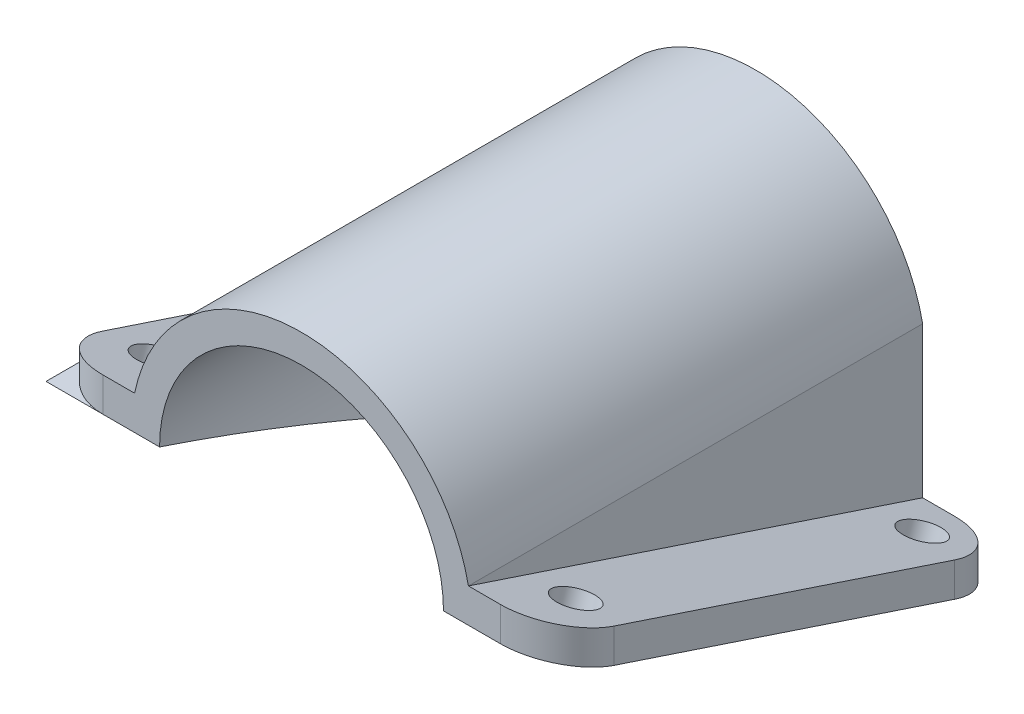
ISO-10303-21;
HEADER;
FILE_DESCRIPTION(('STEP AP214'),'2;1');
FILE_NAME('part.step','',(''),(''),'','','');
FILE_SCHEMA(('AUTOMOTIVE_DESIGN { 1 0 10303 214 1 1 1 1 }'));
ENDSEC;
DATA;
#1=APPLICATION_CONTEXT('core data for automotive mechanical design processes');
#2=APPLICATION_PROTOCOL_DEFINITION('international standard','automotive_design',2000,#1);
#3=PRODUCT_CONTEXT('',#1,'mechanical');
#4=PRODUCT('Part','Part','',(#3));
#5=PRODUCT_RELATED_PRODUCT_CATEGORY('part','',(#4));
#6=PRODUCT_DEFINITION_FORMATION('','',#4);
#7=PRODUCT_DEFINITION_CONTEXT('part definition',#1,'design');
#8=PRODUCT_DEFINITION('design','',#6,#7);
#9=PRODUCT_DEFINITION_SHAPE('','',#8);
#10=(LENGTH_UNIT() NAMED_UNIT(*) SI_UNIT(.MILLI.,.METRE.));
#11=(NAMED_UNIT(*) PLANE_ANGLE_UNIT() SI_UNIT($,.RADIAN.));
#12=(NAMED_UNIT(*) SI_UNIT($,.STERADIAN.) SOLID_ANGLE_UNIT());
#13=UNCERTAINTY_MEASURE_WITH_UNIT(LENGTH_MEASURE(1.E-05),#10,'distance_accuracy_value','');
#14=(GEOMETRIC_REPRESENTATION_CONTEXT(3) GLOBAL_UNCERTAINTY_ASSIGNED_CONTEXT((#13)) GLOBAL_UNIT_ASSIGNED_CONTEXT((#10,
#11,#12)) REPRESENTATION_CONTEXT('',''));
#15=CARTESIAN_POINT('',(0.,0.,0.));
#16=DIRECTION('',(0.,0.,1.));
#17=DIRECTION('',(1.,0.,0.));
#18=AXIS2_PLACEMENT_3D('',#15,#16,#17);
#19=CARTESIAN_POINT('',(22.5,0.,40.));
#20=DIRECTION('',(-1.,0.,0.));
#21=DIRECTION('',(0.,0.,1.));
#22=AXIS2_PLACEMENT_3D('',#19,#20,#21);
#23=PLANE('',#22);
#24=DIRECTION('',(0.,-0.315005947483541,-0.949089697051863));
#25=VECTOR('',#24,1.);
#26=CARTESIAN_POINT('',(22.5,3.,40.));
#27=LINE('',#26,#25);
#28=CARTESIAN_POINT('',(22.5,1.34048378956153,35.));
#29=VERTEX_POINT('',#28);
#30=CARTESIAN_POINT('',(22.5,-8.6166134730693,4.99999999999999));
#31=VERTEX_POINT('',#30);
#32=EDGE_CURVE('E206',#29,#31,#27,.T.);
#33=ORIENTED_EDGE('',*,*,#32,.F.);
#34=DIRECTION('',(0.,1.,0.));
#35=VECTOR('',#34,1.);
#36=CARTESIAN_POINT('',(22.5,0.,35.));
#37=LINE('',#36,#35);
#38=CARTESIAN_POINT('',(22.5,-1.65951621043847,35.));
#39=VERTEX_POINT('',#38);
#40=EDGE_CURVE('E293',#29,#39,#37,.F.);
#41=ORIENTED_EDGE('',*,*,#40,.T.);
#42=DIRECTION('',(0.,-0.315005947483541,-0.949089697051863));
#43=VECTOR('',#42,1.);
#44=CARTESIAN_POINT('',(22.5,0.,40.));
#45=LINE('',#44,#43);
#46=CARTESIAN_POINT('',(22.5,-11.6166134730693,4.99999999999999));
#47=VERTEX_POINT('',#46);
#48=EDGE_CURVE('E235',#39,#47,#45,.T.);
#49=ORIENTED_EDGE('',*,*,#48,.T.);
#50=DIRECTION('',(0.,1.,0.));
#51=VECTOR('',#50,1.);
#52=CARTESIAN_POINT('',(22.5,0.,5.));
#53=LINE('',#52,#51);
#54=EDGE_CURVE('E290',#47,#31,#53,.T.);
#55=ORIENTED_EDGE('',*,*,#54,.T.);
#56=EDGE_LOOP('',(#33,#41,#49,#55));
#57=FACE_BOUND('',#56,.T.);
#58=ADVANCED_FACE('F73',(#57),#23,.F.);
#59=CARTESIAN_POINT('',(0.,0.,40.));
#60=DIRECTION('',(0.,0.,-1.));
#61=DIRECTION('',(-1.,0.,0.));
#62=AXIS2_PLACEMENT_3D('',#59,#60,#61);
#63=CYLINDRICAL_SURFACE('',#62,15.);
#64=CARTESIAN_POINT('',(0.,0.,0.));
#65=DIRECTION('',(0.,0.,1.));
#66=DIRECTION('',(1.,0.,0.));
#67=AXIS2_PLACEMENT_3D('',#64,#65,#66);
#68=CIRCLE('',#67,15.);
#69=CARTESIAN_POINT('',(14.6969384566991,3.,0.));
#70=VERTEX_POINT('',#69);
#71=CARTESIAN_POINT('',(-14.6969384566991,3.,0.));
#72=VERTEX_POINT('',#71);
#73=EDGE_CURVE('E251',#70,#72,#68,.T.);
#74=ORIENTED_EDGE('',*,*,#73,.T.);
#75=DIRECTION('',(0.,0.,-1.));
#76=VECTOR('',#75,1.);
#77=CARTESIAN_POINT('',(-14.6969384566991,3.,40.));
#78=LINE('',#77,#76);
#79=CARTESIAN_POINT('',(-14.6969384566991,3.,40.));
#80=VERTEX_POINT('',#79);
#81=EDGE_CURVE('E183',#80,#72,#78,.T.);
#82=ORIENTED_EDGE('',*,*,#81,.F.);
#83=CARTESIAN_POINT('',(0.,0.,40.));
#84=DIRECTION('',(0.,0.,1.));
#85=DIRECTION('',(1.,0.,0.));
#86=AXIS2_PLACEMENT_3D('',#83,#84,#85);
#87=CIRCLE('',#86,15.);
#88=CARTESIAN_POINT('',(14.6969384566991,3.,40.));
#89=VERTEX_POINT('',#88);
#90=EDGE_CURVE('E254',#89,#80,#87,.T.);
#91=ORIENTED_EDGE('',*,*,#90,.F.);
#92=DIRECTION('',(0.,0.,-1.));
#93=VECTOR('',#92,1.);
#94=CARTESIAN_POINT('',(14.6969384566991,3.,40.));
#95=LINE('',#94,#93);
#96=EDGE_CURVE('E263',#89,#70,#95,.T.);
#97=ORIENTED_EDGE('',*,*,#96,.T.);
#98=EDGE_LOOP('',(#74,#82,#91,#97));
#99=FACE_BOUND('',#98,.T.);
#100=ADVANCED_FACE('F320',(#99),#63,.T.);
#101=CARTESIAN_POINT('',(0.,0.,40.));
#102=DIRECTION('',(0.,0.,-1.));
#103=DIRECTION('',(-1.,0.,0.));
#104=AXIS2_PLACEMENT_3D('',#101,#102,#103);
#105=CYLINDRICAL_SURFACE('',#104,12.5);
#106=CARTESIAN_POINT('',(0.,0.,0.5));
#107=DIRECTION('',(0.,0.,1.));
#108=DIRECTION('',(1.,0.,0.));
#109=AXIS2_PLACEMENT_3D('',#106,#107,#108);
#110=CIRCLE('',#109,12.5);
#111=CARTESIAN_POINT('',(12.5,0.,0.5));
#112=VERTEX_POINT('',#111);
#113=EDGE_CURVE('E12',#112,#112,#110,.F.);
#114=ORIENTED_EDGE('',*,*,#113,.T.);
#115=EDGE_LOOP('',(#114));
#116=FACE_BOUND('',#115,.T.);
#117=CARTESIAN_POINT('',(0.,0.,40.));
#118=DIRECTION('',(0.,-0.949089697051863,0.315005947483541));
#119=DIRECTION('',(0.,-0.315005947483541,-0.949089697051863));
#120=AXIS2_PLACEMENT_3D('',#117,#118,#119);
#121=ELLIPSE('',#120,39.6817904546171,12.5);
#122=CARTESIAN_POINT('',(12.5,0.,40.));
#123=VERTEX_POINT('',#122);
#124=CARTESIAN_POINT('',(-12.5,0.,40.));
#125=VERTEX_POINT('',#124);
#126=EDGE_CURVE('E241',#123,#125,#121,.F.);
#127=ORIENTED_EDGE('',*,*,#126,.F.);
#128=CARTESIAN_POINT('',(0.,0.,40.));
#129=DIRECTION('',(0.,0.,1.));
#130=DIRECTION('',(1.,0.,0.));
#131=AXIS2_PLACEMENT_3D('',#128,#129,#130);
#132=CIRCLE('',#131,12.5);
#133=EDGE_CURVE('E257',#123,#125,#132,.T.);
#134=ORIENTED_EDGE('',*,*,#133,.T.);
#135=EDGE_LOOP('',(#127,#134));
#136=FACE_BOUND('',#135,.T.);
#137=ADVANCED_FACE('F328',(#116,#136),#105,.F.);
#138=CARTESIAN_POINT('',(0.,0.,0.));
#139=DIRECTION('',(0.,0.,1.));
#140=DIRECTION('',(1.,0.,0.));
#141=AXIS2_PLACEMENT_3D('',#138,#139,#140);
#142=PLANE('',#141);
#143=CARTESIAN_POINT('',(0.,0.,0.));
#144=DIRECTION('',(0.,0.,1.));
#145=DIRECTION('',(1.,0.,0.));
#146=AXIS2_PLACEMENT_3D('',#143,#144,#145);
#147=CIRCLE('',#146,13.);
#148=CARTESIAN_POINT('',(13.,0.,0.));
#149=VERTEX_POINT('',#148);
#150=EDGE_CURVE('E82',#149,#149,#147,.T.);
#151=ORIENTED_EDGE('',*,*,#150,.T.);
#152=EDGE_LOOP('',(#151));
#153=FACE_BOUND('',#152,.T.);
#154=DIRECTION('',(1.,0.,0.));
#155=VECTOR('',#154,1.);
#156=CARTESIAN_POINT('',(-22.501,-13.2761296835078,0.));
#157=LINE('',#156,#155);
#158=CARTESIAN_POINT('',(-17.501,-13.2761296835078,0.));
#159=VERTEX_POINT('',#158);
#160=CARTESIAN_POINT('',(17.5,-13.2761296835078,0.));
#161=VERTEX_POINT('',#160);
#162=EDGE_CURVE('E233',#159,#161,#157,.T.);
#163=ORIENTED_EDGE('',*,*,#162,.F.);
#164=DIRECTION('',(0.,1.,0.));
#165=VECTOR('',#164,1.);
#166=CARTESIAN_POINT('',(-17.501,-10.2761296835078,0.));
#167=LINE('',#166,#165);
#168=CARTESIAN_POINT('',(-17.501,-10.2761296835078,0.));
#169=VERTEX_POINT('',#168);
#170=EDGE_CURVE('E191',#159,#169,#167,.T.);
#171=ORIENTED_EDGE('',*,*,#170,.T.);
#172=DIRECTION('',(-1.,0.,0.));
#173=VECTOR('',#172,1.);
#174=CARTESIAN_POINT('',(-14.6969384566991,-10.2761296835078,0.));
#175=LINE('',#174,#173);
#176=CARTESIAN_POINT('',(-14.6969384566991,-10.2761296835078,0.));
#177=VERTEX_POINT('',#176);
#178=EDGE_CURVE('E174',#177,#169,#175,.T.);
#179=ORIENTED_EDGE('',*,*,#178,.F.);
#180=DIRECTION('',(0.,-1.,0.));
#181=VECTOR('',#180,1.);
#182=CARTESIAN_POINT('',(-14.6969384566991,-10.2761296835078,0.));
#183=LINE('',#182,#181);
#184=EDGE_CURVE('E179',#72,#177,#183,.T.);
#185=ORIENTED_EDGE('',*,*,#184,.F.);
#186=ORIENTED_EDGE('',*,*,#73,.F.);
#187=DIRECTION('',(0.,1.,0.));
#188=VECTOR('',#187,1.);
#189=CARTESIAN_POINT('',(14.6969384566991,-10.2761296835078,0.));
#190=LINE('',#189,#188);
#191=CARTESIAN_POINT('',(14.6969384566991,-10.2761296835078,0.));
#192=VERTEX_POINT('',#191);
#193=EDGE_CURVE('E207',#192,#70,#190,.T.);
#194=ORIENTED_EDGE('',*,*,#193,.F.);
#195=DIRECTION('',(1.,0.,0.));
#196=VECTOR('',#195,1.);
#197=CARTESIAN_POINT('',(14.6969384566991,-10.2761296835078,0.));
#198=LINE('',#197,#196);
#199=CARTESIAN_POINT('',(17.5,-10.2761296835078,0.));
#200=VERTEX_POINT('',#199);
#201=EDGE_CURVE('E212',#192,#200,#198,.T.);
#202=ORIENTED_EDGE('',*,*,#201,.T.);
#203=DIRECTION('',(0.,1.,0.));
#204=VECTOR('',#203,1.);
#205=CARTESIAN_POINT('',(17.5,0.,0.));
#206=LINE('',#205,#204);
#207=EDGE_CURVE('E89',#200,#161,#206,.F.);
#208=ORIENTED_EDGE('',*,*,#207,.T.);
#209=EDGE_LOOP('',(#163,#171,#179,#185,#186,#194,#202,#208));
#210=FACE_BOUND('',#209,.T.);
#211=ADVANCED_FACE('F189',(#153,#210),#142,.F.);
#212=CARTESIAN_POINT('',(0.,0.,40.));
#213=DIRECTION('',(0.,0.,1.));
#214=DIRECTION('',(1.,0.,0.));
#215=AXIS2_PLACEMENT_3D('',#212,#213,#214);
#216=PLANE('',#215);
#217=DIRECTION('',(-1.,0.,0.));
#218=VECTOR('',#217,1.);
#219=CARTESIAN_POINT('',(-12.5,3.,40.));
#220=LINE('',#219,#218);
#221=CARTESIAN_POINT('',(-17.5,3.,40.));
#222=VERTEX_POINT('',#221);
#223=EDGE_CURVE('E176',#80,#222,#220,.T.);
#224=ORIENTED_EDGE('',*,*,#223,.T.);
#225=DIRECTION('',(0.,1.,0.));
#226=VECTOR('',#225,1.);
#227=CARTESIAN_POINT('',(-17.5,0.,40.));
#228=LINE('',#227,#226);
#229=CARTESIAN_POINT('',(-17.5,0.,40.));
#230=VERTEX_POINT('',#229);
#231=EDGE_CURVE('E283',#222,#230,#228,.F.);
#232=ORIENTED_EDGE('',*,*,#231,.T.);
#233=DIRECTION('',(-1.,0.,0.));
#234=VECTOR('',#233,1.);
#235=CARTESIAN_POINT('',(-12.5,0.,40.));
#236=LINE('',#235,#234);
#237=EDGE_CURVE('E268',#125,#230,#236,.T.);
#238=ORIENTED_EDGE('',*,*,#237,.F.);
#239=ORIENTED_EDGE('',*,*,#133,.F.);
#240=DIRECTION('',(1.,0.,0.));
#241=VECTOR('',#240,1.);
#242=CARTESIAN_POINT('',(0.,0.,40.));
#243=LINE('',#242,#241);
#244=CARTESIAN_POINT('',(17.5,0.,40.));
#245=VERTEX_POINT('',#244);
#246=EDGE_CURVE('E247',#123,#245,#243,.T.);
#247=ORIENTED_EDGE('',*,*,#246,.T.);
#248=DIRECTION('',(0.,1.,0.));
#249=VECTOR('',#248,1.);
#250=CARTESIAN_POINT('',(17.5,3.,40.));
#251=LINE('',#250,#249);
#252=CARTESIAN_POINT('',(17.5,3.,40.));
#253=VERTEX_POINT('',#252);
#254=EDGE_CURVE('E280',#245,#253,#251,.T.);
#255=ORIENTED_EDGE('',*,*,#254,.T.);
#256=DIRECTION('',(1.,0.,0.));
#257=VECTOR('',#256,1.);
#258=CARTESIAN_POINT('',(0.,3.,40.));
#259=LINE('',#258,#257);
#260=EDGE_CURVE('E250',#89,#253,#259,.T.);
#261=ORIENTED_EDGE('',*,*,#260,.F.);
#262=ORIENTED_EDGE('',*,*,#90,.T.);
#263=EDGE_LOOP('',(#224,#232,#238,#239,#247,#255,#261,#262));
#264=FACE_BOUND('',#263,.T.);
#265=ADVANCED_FACE('F338',(#264),#216,.T.);
#266=CARTESIAN_POINT('',(-22.5,0.,40.));
#267=DIRECTION('',(-1.,0.,0.));
#268=DIRECTION('',(0.,0.,1.));
#269=AXIS2_PLACEMENT_3D('',#266,#267,#268);
#270=PLANE('',#269);
#271=DIRECTION('',(0.,0.,-1.));
#272=VECTOR('',#271,1.);
#273=CARTESIAN_POINT('',(-22.5,0.,40.));
#274=LINE('',#273,#272);
#275=CARTESIAN_POINT('',(-22.5,0.,35.));
#276=VERTEX_POINT('',#275);
#277=CARTESIAN_POINT('',(-22.5,0.,30.9612211645485));
#278=VERTEX_POINT('',#277);
#279=EDGE_CURVE('E261',#276,#278,#274,.T.);
#280=ORIENTED_EDGE('',*,*,#279,.F.);
#281=DIRECTION('',(0.,1.,0.));
#282=VECTOR('',#281,1.);
#283=CARTESIAN_POINT('',(-22.5,0.,35.));
#284=LINE('',#283,#282);
#285=CARTESIAN_POINT('',(-22.5,1.34048378956153,35.));
#286=VERTEX_POINT('',#285);
#287=EDGE_CURVE('E266',#276,#286,#284,.T.);
#288=ORIENTED_EDGE('',*,*,#287,.T.);
#289=DIRECTION('',(0.,0.315005947483541,0.949089697051863));
#290=VECTOR('',#289,1.);
#291=CARTESIAN_POINT('',(-22.5,2.70231375914999,39.1030933021999));
#292=LINE('',#291,#290);
#293=EDGE_CURVE('E204',#278,#286,#292,.T.);
#294=ORIENTED_EDGE('',*,*,#293,.F.);
#295=EDGE_LOOP('',(#280,#288,#294));
#296=FACE_BOUND('',#295,.T.);
#297=ADVANCED_FACE('F334',(#296),#270,.T.);
#298=CARTESIAN_POINT('',(-22.501,0.,0.));
#299=DIRECTION('',(0.,1.,0.));
#300=DIRECTION('',(0.,0.,1.));
#301=AXIS2_PLACEMENT_3D('',#298,#299,#300);
#302=PLANE('',#301);
#303=DIRECTION('',(1.,0.,0.));
#304=VECTOR('',#303,1.);
#305=CARTESIAN_POINT('',(-22.501,0.,30.9612211645485));
#306=LINE('',#305,#304);
#307=CARTESIAN_POINT('',(-22.501,0.,30.9612211645485));
#308=VERTEX_POINT('',#307);
#309=EDGE_CURVE('E201',#308,#278,#306,.T.);
#310=ORIENTED_EDGE('',*,*,#309,.F.);
#311=DIRECTION('',(0.,0.,1.));
#312=VECTOR('',#311,1.);
#313=CARTESIAN_POINT('',(-22.501,0.,0.));
#314=LINE('',#313,#312);
#315=CARTESIAN_POINT('',(-22.501,0.,40.));
#316=VERTEX_POINT('',#315);
#317=EDGE_CURVE('E242',#308,#316,#314,.T.);
#318=ORIENTED_EDGE('',*,*,#317,.T.);
#319=DIRECTION('',(1.,0.,0.));
#320=VECTOR('',#319,1.);
#321=CARTESIAN_POINT('',(-22.501,0.,40.));
#322=LINE('',#321,#320);
#323=EDGE_CURVE('E232',#316,#230,#322,.T.);
#324=ORIENTED_EDGE('',*,*,#323,.T.);
#325=CARTESIAN_POINT('',(-17.5,0.,35.));
#326=DIRECTION('',(0.,1.,0.));
#327=DIRECTION('',(0.,0.,1.));
#328=AXIS2_PLACEMENT_3D('',#325,#326,#327);
#329=CIRCLE('',#328,5.);
#330=EDGE_CURVE('E305',#230,#276,#329,.F.);
#331=ORIENTED_EDGE('',*,*,#330,.T.);
#332=ORIENTED_EDGE('',*,*,#279,.T.);
#333=EDGE_LOOP('',(#310,#318,#324,#331,#332));
#334=FACE_BOUND('',#333,.T.);
#335=ADVANCED_FACE('F337',(#334),#302,.T.);
#336=CARTESIAN_POINT('',(-22.501,0.,40.));
#337=DIRECTION('',(0.,-0.949089697051863,0.315005947483541));
#338=DIRECTION('',(0.,-0.315005947483541,-0.949089697051863));
#339=AXIS2_PLACEMENT_3D('',#336,#337,#338);
#340=PLANE('',#339);
#341=CARTESIAN_POINT('',(-18.501,-11.7010999460901,4.74544848525931));
#342=DIRECTION('',(0.,-0.949089697051863,0.315005947483541));
#343=DIRECTION('',(0.,-0.315005947483541,-0.949089697051863));
#344=AXIS2_PLACEMENT_3D('',#341,#342,#343);
#345=CIRCLE('',#344,1.75);
#346=CARTESIAN_POINT('',(-18.501,-12.2523603541863,3.08454151541855));
#347=VERTEX_POINT('',#346);
#348=EDGE_CURVE('E224',#347,#347,#345,.T.);
#349=ORIENTED_EDGE('',*,*,#348,.F.);
#350=EDGE_LOOP('',(#349));
#351=FACE_BOUND('',#350,.T.);
#352=CARTESIAN_POINT('',(18.5,-1.5750297374177,35.2545515147407));
#353=DIRECTION('',(0.,-0.949089697051863,0.315005947483541));
#354=DIRECTION('',(0.,-0.315005947483541,-0.949089697051863));
#355=AXIS2_PLACEMENT_3D('',#352,#353,#354);
#356=CIRCLE('',#355,1.75);
#357=CARTESIAN_POINT('',(18.5,-2.1262901455139,33.5936445448999));
#358=VERTEX_POINT('',#357);
#359=EDGE_CURVE('E223',#358,#358,#356,.T.);
#360=ORIENTED_EDGE('',*,*,#359,.F.);
#361=EDGE_LOOP('',(#360));
#362=FACE_BOUND('',#361,.T.);
#363=CARTESIAN_POINT('',(18.5,-11.7010999460901,4.74544848525931));
#364=DIRECTION('',(0.,-0.949089697051863,0.315005947483541));
#365=DIRECTION('',(0.,-0.315005947483541,-0.949089697051863));
#366=AXIS2_PLACEMENT_3D('',#363,#364,#365);
#367=CIRCLE('',#366,1.75);
#368=CARTESIAN_POINT('',(18.5,-12.2523603541863,3.08454151541855));
#369=VERTEX_POINT('',#368);
#370=EDGE_CURVE('E220',#369,#369,#367,.T.);
#371=ORIENTED_EDGE('',*,*,#370,.F.);
#372=EDGE_LOOP('',(#371));
#373=FACE_BOUND('',#372,.T.);
#374=CARTESIAN_POINT('',(-18.501,-1.5750297374177,35.2545515147407));
#375=DIRECTION('',(0.,-0.949089697051863,0.315005947483541));
#376=DIRECTION('',(0.,-0.315005947483541,-0.949089697051863));
#377=AXIS2_PLACEMENT_3D('',#374,#375,#376);
#378=CIRCLE('',#377,1.75);
#379=CARTESIAN_POINT('',(-18.501,-2.1262901455139,33.5936445448999));
#380=VERTEX_POINT('',#379);
#381=EDGE_CURVE('E227',#380,#380,#378,.T.);
#382=ORIENTED_EDGE('',*,*,#381,.F.);
#383=EDGE_LOOP('',(#382));
#384=FACE_BOUND('',#383,.T.);
#385=ORIENTED_EDGE('',*,*,#48,.F.);
#386=CARTESIAN_POINT('',(17.5,-1.65951621043847,35.));
#387=DIRECTION('',(0.,-0.949089697051863,0.315005947483541));
#388=DIRECTION('',(0.,-0.315005947483541,-0.949089697051863));
#389=AXIS2_PLACEMENT_3D('',#386,#387,#388);
#390=ELLIPSE('',#389,5.26820596149278,5.);
#391=EDGE_CURVE('E299',#39,#245,#390,.T.);
#392=ORIENTED_EDGE('',*,*,#391,.T.);
#393=ORIENTED_EDGE('',*,*,#246,.F.);
#394=ORIENTED_EDGE('',*,*,#126,.T.);
#395=ORIENTED_EDGE('',*,*,#237,.T.);
#396=ORIENTED_EDGE('',*,*,#323,.F.);
#397=DIRECTION('',(0.,-0.315005947483541,-0.949089697051863));
#398=VECTOR('',#397,1.);
#399=CARTESIAN_POINT('',(-22.501,0.,40.));
#400=LINE('',#399,#398);
#401=CARTESIAN_POINT('',(-22.501,-11.6166134730693,4.99999999999999));
#402=VERTEX_POINT('',#401);
#403=EDGE_CURVE('E236',#316,#402,#400,.T.);
#404=ORIENTED_EDGE('',*,*,#403,.T.);
#405=CARTESIAN_POINT('',(-17.501,-11.6166134730693,5.));
#406=DIRECTION('',(0.,-0.949089697051863,0.315005947483541));
#407=DIRECTION('',(0.,-0.315005947483541,-0.949089697051863));
#408=AXIS2_PLACEMENT_3D('',#405,#406,#407);
#409=ELLIPSE('',#408,5.26820596149278,5.);
#410=EDGE_CURVE('E297',#402,#159,#409,.T.);
#411=ORIENTED_EDGE('',*,*,#410,.T.);
#412=ORIENTED_EDGE('',*,*,#162,.T.);
#413=CARTESIAN_POINT('',(17.5,-11.6166134730693,5.));
#414=DIRECTION('',(0.,-0.949089697051863,0.315005947483541));
#415=DIRECTION('',(0.,0.315005947483541,0.949089697051863));
#416=AXIS2_PLACEMENT_3D('',#413,#414,#415);
#417=ELLIPSE('',#416,5.26820596149278,5.);
#418=EDGE_CURVE('E295',#161,#47,#417,.T.);
#419=ORIENTED_EDGE('',*,*,#418,.T.);
#420=EDGE_LOOP('',(#385,#392,#393,#394,#395,#396,#404,#411,#412,#419));
#421=FACE_BOUND('',#420,.T.);
#422=ADVANCED_FACE('F356',(#351,#362,#373,#384,#421),#340,.T.);
#423=CARTESIAN_POINT('',(-22.501,0.,0.));
#424=DIRECTION('',(-1.,0.,0.));
#425=DIRECTION('',(0.,0.,1.));
#426=AXIS2_PLACEMENT_3D('',#423,#424,#425);
#427=PLANE('',#426);
#428=DIRECTION('',(0.,0.315005947483541,0.949089697051863));
#429=VECTOR('',#428,1.);
#430=CARTESIAN_POINT('',(-22.501,3.,40.));
#431=LINE('',#430,#429);
#432=CARTESIAN_POINT('',(-22.501,-8.61661347306931,4.99999999999998));
#433=VERTEX_POINT('',#432);
#434=EDGE_CURVE('E186',#433,#308,#431,.T.);
#435=ORIENTED_EDGE('',*,*,#434,.F.);
#436=DIRECTION('',(0.,1.,0.));
#437=VECTOR('',#436,1.);
#438=CARTESIAN_POINT('',(-22.501,-13.2761296835078,5.));
#439=LINE('',#438,#437);
#440=EDGE_CURVE('E303',#433,#402,#439,.F.);
#441=ORIENTED_EDGE('',*,*,#440,.T.);
#442=ORIENTED_EDGE('',*,*,#403,.F.);
#443=ORIENTED_EDGE('',*,*,#317,.F.);
#444=EDGE_LOOP('',(#435,#441,#442,#443));
#445=FACE_BOUND('',#444,.T.);
#446=ADVANCED_FACE('F363',(#445),#427,.T.);
#447=CARTESIAN_POINT('',(-18.501,23.8952950289998,26.8008681477402));
#448=DIRECTION('',(0.,-0.949089697051863,0.315005947483541));
#449=DIRECTION('',(0.,-0.315005947483541,-0.949089697051863));
#450=AXIS2_PLACEMENT_3D('',#447,#448,#449);
#451=CYLINDRICAL_SURFACE('',#450,1.75);
#452=CARTESIAN_POINT('',(-18.501,1.12728402173229,34.3576448169406));
#453=DIRECTION('',(0.,-0.949089697051863,0.315005947483541));
#454=DIRECTION('',(0.,-0.315005947483541,-0.949089697051863));
#455=AXIS2_PLACEMENT_3D('',#452,#453,#454);
#456=CIRCLE('',#455,1.75);
#457=CARTESIAN_POINT('',(-18.501,0.576023613636088,32.6967378470999));
#458=VERTEX_POINT('',#457);
#459=EDGE_CURVE('E195',#458,#458,#456,.F.);
#460=ORIENTED_EDGE('',*,*,#459,.T.);
#461=EDGE_LOOP('',(#460));
#462=FACE_BOUND('',#461,.T.);
#463=ORIENTED_EDGE('',*,*,#381,.T.);
#464=EDGE_LOOP('',(#463));
#465=FACE_BOUND('',#464,.T.);
#466=ADVANCED_FACE('F405',(#462,#465),#451,.F.);
#467=CARTESIAN_POINT('',(18.5,13.7692248203274,-3.70823488174116));
#468=DIRECTION('',(0.,-0.949089697051863,0.315005947483541));
#469=DIRECTION('',(0.,-0.315005947483541,-0.949089697051863));
#470=AXIS2_PLACEMENT_3D('',#467,#468,#469);
#471=CYLINDRICAL_SURFACE('',#470,1.75);
#472=CARTESIAN_POINT('',(18.5,-8.99878618694009,3.84854178745924));
#473=DIRECTION('',(0.,-0.949089697051863,0.315005947483541));
#474=DIRECTION('',(0.,-0.315005947483541,-0.949089697051863));
#475=AXIS2_PLACEMENT_3D('',#472,#473,#474);
#476=CIRCLE('',#475,1.75);
#477=CARTESIAN_POINT('',(18.5,-9.55004659503628,2.18763481761848));
#478=VERTEX_POINT('',#477);
#479=EDGE_CURVE('E217',#478,#478,#476,.F.);
#480=ORIENTED_EDGE('',*,*,#479,.T.);
#481=EDGE_LOOP('',(#480));
#482=FACE_BOUND('',#481,.T.);
#483=ORIENTED_EDGE('',*,*,#370,.T.);
#484=EDGE_LOOP('',(#483));
#485=FACE_BOUND('',#484,.T.);
#486=ADVANCED_FACE('F408',(#482,#485),#471,.F.);
#487=CARTESIAN_POINT('',(18.5,23.8952950289998,26.8008681477402));
#488=DIRECTION('',(0.,-0.949089697051863,0.315005947483541));
#489=DIRECTION('',(0.,-0.315005947483541,-0.949089697051863));
#490=AXIS2_PLACEMENT_3D('',#487,#488,#489);
#491=CYLINDRICAL_SURFACE('',#490,1.75);
#492=CARTESIAN_POINT('',(18.5,1.12728402173228,34.3576448169406));
#493=DIRECTION('',(0.,-0.949089697051863,0.315005947483541));
#494=DIRECTION('',(0.,-0.315005947483541,-0.949089697051863));
#495=AXIS2_PLACEMENT_3D('',#492,#493,#494);
#496=CIRCLE('',#495,1.75);
#497=CARTESIAN_POINT('',(18.5,0.576023613636085,32.6967378470999));
#498=VERTEX_POINT('',#497);
#499=EDGE_CURVE('E216',#498,#498,#496,.F.);
#500=ORIENTED_EDGE('',*,*,#499,.T.);
#501=EDGE_LOOP('',(#500));
#502=FACE_BOUND('',#501,.T.);
#503=ORIENTED_EDGE('',*,*,#359,.T.);
#504=EDGE_LOOP('',(#503));
#505=FACE_BOUND('',#504,.T.);
#506=ADVANCED_FACE('F410',(#502,#505),#491,.F.);
#507=CARTESIAN_POINT('',(-18.501,13.7692248203274,-3.70823488174116));
#508=DIRECTION('',(0.,-0.949089697051863,0.315005947483541));
#509=DIRECTION('',(0.,-0.315005947483541,-0.949089697051863));
#510=AXIS2_PLACEMENT_3D('',#507,#508,#509);
#511=CYLINDRICAL_SURFACE('',#510,1.75);
#512=CARTESIAN_POINT('',(-18.501,-8.99878618694009,3.84854178745925));
#513=DIRECTION('',(0.,-0.949089697051863,0.315005947483541));
#514=DIRECTION('',(0.,-0.315005947483541,-0.949089697051863));
#515=AXIS2_PLACEMENT_3D('',#512,#513,#514);
#516=CIRCLE('',#515,1.75);
#517=CARTESIAN_POINT('',(-18.501,-9.55004659503629,2.18763481761849));
#518=VERTEX_POINT('',#517);
#519=EDGE_CURVE('E192',#518,#518,#516,.F.);
#520=ORIENTED_EDGE('',*,*,#519,.T.);
#521=EDGE_LOOP('',(#520));
#522=FACE_BOUND('',#521,.T.);
#523=ORIENTED_EDGE('',*,*,#348,.T.);
#524=EDGE_LOOP('',(#523));
#525=FACE_BOUND('',#524,.T.);
#526=ADVANCED_FACE('F413',(#522,#525),#511,.F.);
#527=CARTESIAN_POINT('',(14.6969384566991,0.,0.));
#528=DIRECTION('',(1.,0.,0.));
#529=DIRECTION('',(0.,0.,-1.));
#530=AXIS2_PLACEMENT_3D('',#527,#528,#529);
#531=PLANE('',#530);
#532=ORIENTED_EDGE('',*,*,#96,.F.);
#533=DIRECTION('',(0.,-0.315005947483541,-0.949089697051863));
#534=VECTOR('',#533,1.);
#535=CARTESIAN_POINT('',(14.6969384566991,3.,40.));
#536=LINE('',#535,#534);
#537=EDGE_CURVE('E209',#89,#192,#536,.T.);
#538=ORIENTED_EDGE('',*,*,#537,.T.);
#539=ORIENTED_EDGE('',*,*,#193,.T.);
#540=EDGE_LOOP('',(#532,#538,#539));
#541=FACE_BOUND('',#540,.T.);
#542=ADVANCED_FACE('F378',(#541),#531,.T.);
#543=CARTESIAN_POINT('',(14.6969384566991,3.,40.));
#544=DIRECTION('',(0.,-0.949089697051863,0.315005947483541));
#545=DIRECTION('',(0.,-0.315005947483541,-0.949089697051863));
#546=AXIS2_PLACEMENT_3D('',#543,#544,#545);
#547=PLANE('',#546);
#548=ORIENTED_EDGE('',*,*,#499,.F.);
#549=EDGE_LOOP('',(#548));
#550=FACE_BOUND('',#549,.T.);
#551=ORIENTED_EDGE('',*,*,#260,.T.);
#552=CARTESIAN_POINT('',(17.5,1.34048378956153,35.));
#553=DIRECTION('',(0.,-0.949089697051863,0.315005947483541));
#554=DIRECTION('',(0.,-0.315005947483541,-0.949089697051863));
#555=AXIS2_PLACEMENT_3D('',#552,#553,#554);
#556=ELLIPSE('',#555,5.26820596149278,5.);
#557=EDGE_CURVE('E288',#253,#29,#556,.F.);
#558=ORIENTED_EDGE('',*,*,#557,.T.);
#559=ORIENTED_EDGE('',*,*,#32,.T.);
#560=CARTESIAN_POINT('',(17.5,-8.61661347306931,5.));
#561=DIRECTION('',(0.,-0.949089697051863,0.315005947483541));
#562=DIRECTION('',(0.,0.315005947483541,0.949089697051863));
#563=AXIS2_PLACEMENT_3D('',#560,#561,#562);
#564=ELLIPSE('',#563,5.26820596149278,5.);
#565=EDGE_CURVE('E286',#31,#200,#564,.F.);
#566=ORIENTED_EDGE('',*,*,#565,.T.);
#567=ORIENTED_EDGE('',*,*,#201,.F.);
#568=ORIENTED_EDGE('',*,*,#537,.F.);
#569=EDGE_LOOP('',(#551,#558,#559,#566,#567,#568));
#570=FACE_BOUND('',#569,.T.);
#571=ORIENTED_EDGE('',*,*,#479,.F.);
#572=EDGE_LOOP('',(#571));
#573=FACE_BOUND('',#572,.T.);
#574=ADVANCED_FACE('F380',(#550,#570,#573),#547,.F.);
#575=CARTESIAN_POINT('',(-14.6969384566991,3.,40.));
#576=DIRECTION('',(0.,-0.949089697051863,0.315005947483541));
#577=DIRECTION('',(0.,-0.315005947483541,-0.949089697051863));
#578=AXIS2_PLACEMENT_3D('',#575,#576,#577);
#579=PLANE('',#578);
#580=ORIENTED_EDGE('',*,*,#293,.T.);
#581=CARTESIAN_POINT('',(-17.5,1.34048378956153,35.));
#582=DIRECTION('',(0.,-0.949089697051863,0.315005947483541));
#583=DIRECTION('',(0.,0.315005947483541,0.949089697051863));
#584=AXIS2_PLACEMENT_3D('',#581,#582,#583);
#585=ELLIPSE('',#584,5.26820596149278,5.);
#586=EDGE_CURVE('E278',#286,#222,#585,.F.);
#587=ORIENTED_EDGE('',*,*,#586,.T.);
#588=ORIENTED_EDGE('',*,*,#223,.F.);
#589=DIRECTION('',(0.,0.315005947483541,0.949089697051863));
#590=VECTOR('',#589,1.);
#591=CARTESIAN_POINT('',(-14.6969384566991,3.,40.));
#592=LINE('',#591,#590);
#593=EDGE_CURVE('E168',#177,#80,#592,.T.);
#594=ORIENTED_EDGE('',*,*,#593,.F.);
#595=ORIENTED_EDGE('',*,*,#178,.T.);
#596=CARTESIAN_POINT('',(-17.501,-8.61661347306931,5.));
#597=DIRECTION('',(0.,-0.949089697051863,0.315005947483541));
#598=DIRECTION('',(0.,-0.315005947483541,-0.949089697051863));
#599=AXIS2_PLACEMENT_3D('',#596,#597,#598);
#600=ELLIPSE('',#599,5.26820596149278,5.);
#601=EDGE_CURVE('E276',#169,#433,#600,.F.);
#602=ORIENTED_EDGE('',*,*,#601,.T.);
#603=ORIENTED_EDGE('',*,*,#434,.T.);
#604=ORIENTED_EDGE('',*,*,#309,.T.);
#605=EDGE_LOOP('',(#580,#587,#588,#594,#595,#602,#603,#604));
#606=FACE_BOUND('',#605,.T.);
#607=ORIENTED_EDGE('',*,*,#519,.F.);
#608=EDGE_LOOP('',(#607));
#609=FACE_BOUND('',#608,.T.);
#610=ORIENTED_EDGE('',*,*,#459,.F.);
#611=EDGE_LOOP('',(#610));
#612=FACE_BOUND('',#611,.T.);
#613=ADVANCED_FACE('F171',(#606,#609,#612),#579,.F.);
#614=CARTESIAN_POINT('',(-14.6969384566991,0.,0.));
#615=DIRECTION('',(1.,0.,0.));
#616=DIRECTION('',(0.,0.,-1.));
#617=AXIS2_PLACEMENT_3D('',#614,#615,#616);
#618=PLANE('',#617);
#619=ORIENTED_EDGE('',*,*,#184,.T.);
#620=ORIENTED_EDGE('',*,*,#593,.T.);
#621=ORIENTED_EDGE('',*,*,#81,.T.);
#622=EDGE_LOOP('',(#619,#620,#621));
#623=FACE_BOUND('',#622,.T.);
#624=ADVANCED_FACE('F182',(#623),#618,.F.);
#625=CARTESIAN_POINT('',(-17.5,0.,35.));
#626=DIRECTION('',(0.,1.,0.));
#627=DIRECTION('',(0.,0.,1.));
#628=AXIS2_PLACEMENT_3D('',#625,#626,#627);
#629=CYLINDRICAL_SURFACE('',#628,5.);
#630=ORIENTED_EDGE('',*,*,#330,.F.);
#631=ORIENTED_EDGE('',*,*,#231,.F.);
#632=ORIENTED_EDGE('',*,*,#586,.F.);
#633=ORIENTED_EDGE('',*,*,#287,.F.);
#634=EDGE_LOOP('',(#630,#631,#632,#633));
#635=FACE_BOUND('',#634,.T.);
#636=ADVANCED_FACE('F340',(#635),#629,.T.);
#637=CARTESIAN_POINT('',(17.5,0.,35.));
#638=DIRECTION('',(0.,-1.,0.));
#639=DIRECTION('',(0.,0.,-1.));
#640=AXIS2_PLACEMENT_3D('',#637,#638,#639);
#641=CYLINDRICAL_SURFACE('',#640,5.);
#642=ORIENTED_EDGE('',*,*,#391,.F.);
#643=ORIENTED_EDGE('',*,*,#40,.F.);
#644=ORIENTED_EDGE('',*,*,#557,.F.);
#645=ORIENTED_EDGE('',*,*,#254,.F.);
#646=EDGE_LOOP('',(#642,#643,#644,#645));
#647=FACE_BOUND('',#646,.T.);
#648=ADVANCED_FACE('F343',(#647),#641,.T.);
#649=CARTESIAN_POINT('',(-17.501,0.,5.));
#650=DIRECTION('',(0.,-1.,0.));
#651=DIRECTION('',(0.,0.,-1.));
#652=AXIS2_PLACEMENT_3D('',#649,#650,#651);
#653=CYLINDRICAL_SURFACE('',#652,5.);
#654=ORIENTED_EDGE('',*,*,#410,.F.);
#655=ORIENTED_EDGE('',*,*,#440,.F.);
#656=ORIENTED_EDGE('',*,*,#601,.F.);
#657=ORIENTED_EDGE('',*,*,#170,.F.);
#658=EDGE_LOOP('',(#654,#655,#656,#657));
#659=FACE_BOUND('',#658,.T.);
#660=ADVANCED_FACE('F316',(#659),#653,.T.);
#661=CARTESIAN_POINT('',(17.5,0.,5.));
#662=DIRECTION('',(0.,1.,0.));
#663=DIRECTION('',(0.,0.,1.));
#664=AXIS2_PLACEMENT_3D('',#661,#662,#663);
#665=CYLINDRICAL_SURFACE('',#664,5.);
#666=ORIENTED_EDGE('',*,*,#418,.F.);
#667=ORIENTED_EDGE('',*,*,#207,.F.);
#668=ORIENTED_EDGE('',*,*,#565,.F.);
#669=ORIENTED_EDGE('',*,*,#54,.F.);
#670=EDGE_LOOP('',(#666,#667,#668,#669));
#671=FACE_BOUND('',#670,.T.);
#672=ADVANCED_FACE('F311',(#671),#665,.T.);
#673=CARTESIAN_POINT('',(0.,0.,0.5));
#674=DIRECTION('',(0.,0.,1.));
#675=DIRECTION('',(1.,0.,0.));
#676=AXIS2_PLACEMENT_3D('',#673,#674,#675);
#677=TOROIDAL_SURFACE('',#676,13.,0.5);
#678=ORIENTED_EDGE('',*,*,#113,.F.);
#679=EDGE_LOOP('',(#678));
#680=FACE_BOUND('',#679,.T.);
#681=ORIENTED_EDGE('',*,*,#150,.F.);
#682=EDGE_LOOP('',(#681));
#683=FACE_BOUND('',#682,.T.);
#684=ADVANCED_FACE('F75',(#680,#683),#677,.T.);
#685=CLOSED_SHELL('',(#58,#100,#137,#211,#265,#297,#335,#422,#446,#466,#486,#506,#526,#542,#574,
#613,#624,#636,#648,#660,#672,#684));
#686=MANIFOLD_SOLID_BREP('B2',#685);
#687=ADVANCED_BREP_SHAPE_REPRESENTATION('',(#18,#686),#14);
#688=SHAPE_DEFINITION_REPRESENTATION(#9,#687);
ENDSEC;
END-ISO-10303-21;
